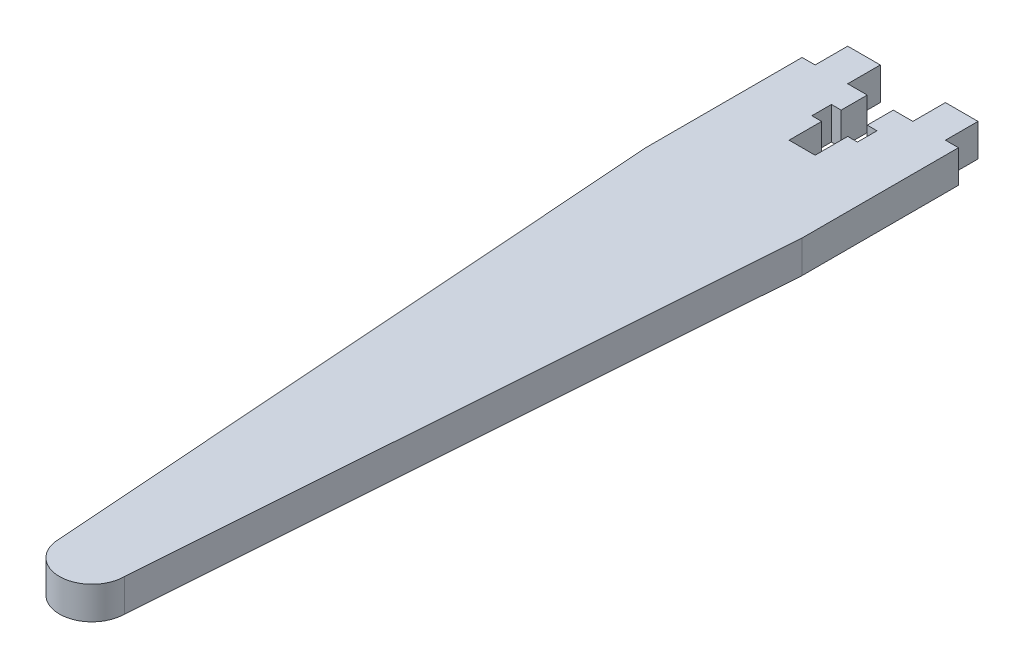
ISO-10303-21;
HEADER;
FILE_DESCRIPTION(('STEP AP214'),'2;1');
FILE_NAME('part.step','',(''),(''),'','','');
FILE_SCHEMA(('AUTOMOTIVE_DESIGN { 1 0 10303 214 1 1 1 1 }'));
ENDSEC;
DATA;
#1=APPLICATION_CONTEXT('core data for automotive mechanical design processes');
#2=APPLICATION_PROTOCOL_DEFINITION('international standard','automotive_design',2000,#1);
#3=PRODUCT_CONTEXT('',#1,'mechanical');
#4=PRODUCT('Part','Part','',(#3));
#5=PRODUCT_RELATED_PRODUCT_CATEGORY('part','',(#4));
#6=PRODUCT_DEFINITION_FORMATION('','',#4);
#7=PRODUCT_DEFINITION_CONTEXT('part definition',#1,'design');
#8=PRODUCT_DEFINITION('design','',#6,#7);
#9=PRODUCT_DEFINITION_SHAPE('','',#8);
#10=(LENGTH_UNIT() NAMED_UNIT(*) SI_UNIT(.MILLI.,.METRE.));
#11=(NAMED_UNIT(*) PLANE_ANGLE_UNIT() SI_UNIT($,.RADIAN.));
#12=(NAMED_UNIT(*) SI_UNIT($,.STERADIAN.) SOLID_ANGLE_UNIT());
#13=UNCERTAINTY_MEASURE_WITH_UNIT(LENGTH_MEASURE(1.E-05),#10,'distance_accuracy_value','');
#14=(GEOMETRIC_REPRESENTATION_CONTEXT(3) GLOBAL_UNCERTAINTY_ASSIGNED_CONTEXT((#13)) GLOBAL_UNIT_ASSIGNED_CONTEXT((#10,
#11,#12)) REPRESENTATION_CONTEXT('',''));
#15=CARTESIAN_POINT('',(0.,0.,0.));
#16=DIRECTION('',(0.,0.,1.));
#17=DIRECTION('',(1.,0.,0.));
#18=AXIS2_PLACEMENT_3D('',#15,#16,#17);
#19=CARTESIAN_POINT('',(0.,5.,0.));
#20=DIRECTION('',(0.997406236533879,0.,-0.0719777696467749));
#21=DIRECTION('',(-0.0719777696467749,0.,-0.997406236533879));
#22=AXIS2_PLACEMENT_3D('',#19,#20,#21);
#23=PLANE('',#22);
#24=DIRECTION('',(0.0719777696467749,0.,0.997406236533879));
#25=VECTOR('',#24,1.);
#26=CARTESIAN_POINT('',(0.,0.,0.));
#27=LINE('',#26,#25);
#28=CARTESIAN_POINT('',(0.,0.,0.));
#29=VERTEX_POINT('',#28);
#30=CARTESIAN_POINT('',(7.00000000000001,0.,97.));
#31=VERTEX_POINT('',#30);
#32=EDGE_CURVE('E237',#29,#31,#27,.T.);
#33=ORIENTED_EDGE('',*,*,#32,.T.);
#34=DIRECTION('',(0.,-1.,0.));
#35=VECTOR('',#34,1.);
#36=CARTESIAN_POINT('',(7.00000000000001,5.,97.));
#37=LINE('',#36,#35);
#38=CARTESIAN_POINT('',(7.00000000000001,5.,97.));
#39=VERTEX_POINT('',#38);
#40=EDGE_CURVE('E11',#39,#31,#37,.T.);
#41=ORIENTED_EDGE('',*,*,#40,.F.);
#42=DIRECTION('',(0.0719777696467749,0.,0.997406236533879));
#43=VECTOR('',#42,1.);
#44=CARTESIAN_POINT('',(0.,5.,0.));
#45=LINE('',#44,#43);
#46=CARTESIAN_POINT('',(0.,5.,0.));
#47=VERTEX_POINT('',#46);
#48=EDGE_CURVE('E287',#47,#39,#45,.T.);
#49=ORIENTED_EDGE('',*,*,#48,.F.);
#50=DIRECTION('',(0.,-1.,0.));
#51=VECTOR('',#50,1.);
#52=CARTESIAN_POINT('',(0.,5.,0.));
#53=LINE('',#52,#51);
#54=EDGE_CURVE('E233',#47,#29,#53,.T.);
#55=ORIENTED_EDGE('',*,*,#54,.T.);
#56=EDGE_LOOP('',(#33,#41,#49,#55));
#57=FACE_BOUND('',#56,.T.);
#58=ADVANCED_FACE('F33',(#57),#23,.F.);
#59=CARTESIAN_POINT('',(12.,5.,97.));
#60=DIRECTION('',(0.,-1.,0.));
#61=DIRECTION('',(0.,0.,-1.));
#62=AXIS2_PLACEMENT_3D('',#59,#60,#61);
#63=CYLINDRICAL_SURFACE('',#62,5.);
#64=CARTESIAN_POINT('',(12.,0.,97.));
#65=DIRECTION('',(0.,1.,0.));
#66=DIRECTION('',(0.,0.,1.));
#67=AXIS2_PLACEMENT_3D('',#64,#65,#66);
#68=CIRCLE('',#67,5.);
#69=CARTESIAN_POINT('',(17.,0.,97.));
#70=VERTEX_POINT('',#69);
#71=EDGE_CURVE('E240',#31,#70,#68,.T.);
#72=ORIENTED_EDGE('',*,*,#71,.T.);
#73=DIRECTION('',(0.,-1.,0.));
#74=VECTOR('',#73,1.);
#75=CARTESIAN_POINT('',(17.,5.,97.));
#76=LINE('',#75,#74);
#77=CARTESIAN_POINT('',(17.,5.,97.));
#78=VERTEX_POINT('',#77);
#79=EDGE_CURVE('E41',#78,#70,#76,.T.);
#80=ORIENTED_EDGE('',*,*,#79,.F.);
#81=CARTESIAN_POINT('',(12.,5.,97.));
#82=DIRECTION('',(0.,1.,0.));
#83=DIRECTION('',(0.,0.,1.));
#84=AXIS2_PLACEMENT_3D('',#81,#82,#83);
#85=CIRCLE('',#84,5.);
#86=EDGE_CURVE('E146',#39,#78,#85,.T.);
#87=ORIENTED_EDGE('',*,*,#86,.F.);
#88=ORIENTED_EDGE('',*,*,#40,.T.);
#89=EDGE_LOOP('',(#72,#80,#87,#88));
#90=FACE_BOUND('',#89,.T.);
#91=ADVANCED_FACE('F435',(#90),#63,.T.);
#92=CARTESIAN_POINT('',(24.,5.,0.));
#93=DIRECTION('',(-0.997406236533879,0.,-0.0719777696467746));
#94=DIRECTION('',(-0.0719777696467746,0.,0.997406236533879));
#95=AXIS2_PLACEMENT_3D('',#92,#93,#94);
#96=PLANE('',#95);
#97=DIRECTION('',(0.0719777696467746,0.,-0.997406236533879));
#98=VECTOR('',#97,1.);
#99=CARTESIAN_POINT('',(24.,0.,0.));
#100=LINE('',#99,#98);
#101=CARTESIAN_POINT('',(24.,0.,0.));
#102=VERTEX_POINT('',#101);
#103=EDGE_CURVE('E242',#70,#102,#100,.T.);
#104=ORIENTED_EDGE('',*,*,#103,.T.);
#105=DIRECTION('',(0.,-1.,0.));
#106=VECTOR('',#105,1.);
#107=CARTESIAN_POINT('',(24.,5.,0.));
#108=LINE('',#107,#106);
#109=CARTESIAN_POINT('',(24.,5.,0.));
#110=VERTEX_POINT('',#109);
#111=EDGE_CURVE('E348',#110,#102,#108,.T.);
#112=ORIENTED_EDGE('',*,*,#111,.F.);
#113=DIRECTION('',(0.0719777696467746,0.,-0.997406236533879));
#114=VECTOR('',#113,1.);
#115=CARTESIAN_POINT('',(24.,5.,0.));
#116=LINE('',#115,#114);
#117=EDGE_CURVE('E356',#78,#110,#116,.T.);
#118=ORIENTED_EDGE('',*,*,#117,.F.);
#119=ORIENTED_EDGE('',*,*,#79,.T.);
#120=EDGE_LOOP('',(#104,#112,#118,#119));
#121=FACE_BOUND('',#120,.T.);
#122=ADVANCED_FACE('F354',(#121),#96,.F.);
#123=CARTESIAN_POINT('',(24.,5.,0.));
#124=DIRECTION('',(-1.,0.,0.));
#125=DIRECTION('',(0.,0.,1.));
#126=AXIS2_PLACEMENT_3D('',#123,#124,#125);
#127=PLANE('',#126);
#128=DIRECTION('',(0.,0.,-1.));
#129=VECTOR('',#128,1.);
#130=CARTESIAN_POINT('',(24.,0.,0.));
#131=LINE('',#130,#129);
#132=CARTESIAN_POINT('',(24.,0.,-24.));
#133=VERTEX_POINT('',#132);
#134=EDGE_CURVE('E244',#102,#133,#131,.T.);
#135=ORIENTED_EDGE('',*,*,#134,.T.);
#136=DIRECTION('',(0.,-1.,0.));
#137=VECTOR('',#136,1.);
#138=CARTESIAN_POINT('',(24.,5.,-24.));
#139=LINE('',#138,#137);
#140=CARTESIAN_POINT('',(24.,5.,-24.));
#141=VERTEX_POINT('',#140);
#142=EDGE_CURVE('E345',#141,#133,#139,.T.);
#143=ORIENTED_EDGE('',*,*,#142,.F.);
#144=DIRECTION('',(0.,0.,-1.));
#145=VECTOR('',#144,1.);
#146=CARTESIAN_POINT('',(24.,5.,0.));
#147=LINE('',#146,#145);
#148=EDGE_CURVE('E374',#110,#141,#147,.T.);
#149=ORIENTED_EDGE('',*,*,#148,.F.);
#150=ORIENTED_EDGE('',*,*,#111,.T.);
#151=EDGE_LOOP('',(#135,#143,#149,#150));
#152=FACE_BOUND('',#151,.T.);
#153=ADVANCED_FACE('F365',(#152),#127,.F.);
#154=CARTESIAN_POINT('',(22.,5.,-24.));
#155=DIRECTION('',(0.,0.,1.));
#156=DIRECTION('',(1.,0.,0.));
#157=AXIS2_PLACEMENT_3D('',#154,#155,#156);
#158=PLANE('',#157);
#159=DIRECTION('',(-1.,0.,0.));
#160=VECTOR('',#159,1.);
#161=CARTESIAN_POINT('',(22.,0.,-24.));
#162=LINE('',#161,#160);
#163=CARTESIAN_POINT('',(22.,0.,-24.));
#164=VERTEX_POINT('',#163);
#165=EDGE_CURVE('E246',#133,#164,#162,.T.);
#166=ORIENTED_EDGE('',*,*,#165,.T.);
#167=DIRECTION('',(0.,-1.,0.));
#168=VECTOR('',#167,1.);
#169=CARTESIAN_POINT('',(22.,5.,-24.));
#170=LINE('',#169,#168);
#171=CARTESIAN_POINT('',(22.,5.,-24.));
#172=VERTEX_POINT('',#171);
#173=EDGE_CURVE('E342',#172,#164,#170,.T.);
#174=ORIENTED_EDGE('',*,*,#173,.F.);
#175=DIRECTION('',(-1.,0.,0.));
#176=VECTOR('',#175,1.);
#177=CARTESIAN_POINT('',(22.,5.,-24.));
#178=LINE('',#177,#176);
#179=EDGE_CURVE('E371',#141,#172,#178,.T.);
#180=ORIENTED_EDGE('',*,*,#179,.F.);
#181=ORIENTED_EDGE('',*,*,#142,.T.);
#182=EDGE_LOOP('',(#166,#174,#180,#181));
#183=FACE_BOUND('',#182,.T.);
#184=ADVANCED_FACE('F369',(#183),#158,.F.);
#185=CARTESIAN_POINT('',(22.,5.,-24.));
#186=DIRECTION('',(-1.,0.,0.));
#187=DIRECTION('',(0.,0.,1.));
#188=AXIS2_PLACEMENT_3D('',#185,#186,#187);
#189=PLANE('',#188);
#190=DIRECTION('',(0.,0.,-1.));
#191=VECTOR('',#190,1.);
#192=CARTESIAN_POINT('',(22.,0.,-24.));
#193=LINE('',#192,#191);
#194=CARTESIAN_POINT('',(22.,0.,-29.));
#195=VERTEX_POINT('',#194);
#196=EDGE_CURVE('E248',#164,#195,#193,.T.);
#197=ORIENTED_EDGE('',*,*,#196,.T.);
#198=DIRECTION('',(0.,-1.,0.));
#199=VECTOR('',#198,1.);
#200=CARTESIAN_POINT('',(22.,5.,-29.));
#201=LINE('',#200,#199);
#202=CARTESIAN_POINT('',(22.,5.,-29.));
#203=VERTEX_POINT('',#202);
#204=EDGE_CURVE('E339',#203,#195,#201,.T.);
#205=ORIENTED_EDGE('',*,*,#204,.F.);
#206=DIRECTION('',(0.,0.,-1.));
#207=VECTOR('',#206,1.);
#208=CARTESIAN_POINT('',(22.,5.,-24.));
#209=LINE('',#208,#207);
#210=EDGE_CURVE('E373',#172,#203,#209,.T.);
#211=ORIENTED_EDGE('',*,*,#210,.F.);
#212=ORIENTED_EDGE('',*,*,#173,.T.);
#213=EDGE_LOOP('',(#197,#205,#211,#212));
#214=FACE_BOUND('',#213,.T.);
#215=ADVANCED_FACE('F448',(#214),#189,.F.);
#216=CARTESIAN_POINT('',(17.,5.,-29.));
#217=DIRECTION('',(0.,0.,1.));
#218=DIRECTION('',(1.,0.,0.));
#219=AXIS2_PLACEMENT_3D('',#216,#217,#218);
#220=PLANE('',#219);
#221=DIRECTION('',(-1.,0.,0.));
#222=VECTOR('',#221,1.);
#223=CARTESIAN_POINT('',(17.,0.,-29.));
#224=LINE('',#223,#222);
#225=CARTESIAN_POINT('',(17.,0.,-29.));
#226=VERTEX_POINT('',#225);
#227=EDGE_CURVE('E250',#195,#226,#224,.T.);
#228=ORIENTED_EDGE('',*,*,#227,.T.);
#229=DIRECTION('',(0.,-1.,0.));
#230=VECTOR('',#229,1.);
#231=CARTESIAN_POINT('',(17.,5.,-29.));
#232=LINE('',#231,#230);
#233=CARTESIAN_POINT('',(17.,5.,-29.));
#234=VERTEX_POINT('',#233);
#235=EDGE_CURVE('E336',#234,#226,#232,.T.);
#236=ORIENTED_EDGE('',*,*,#235,.F.);
#237=DIRECTION('',(-1.,0.,0.));
#238=VECTOR('',#237,1.);
#239=CARTESIAN_POINT('',(17.,5.,-29.));
#240=LINE('',#239,#238);
#241=EDGE_CURVE('E376',#203,#234,#240,.T.);
#242=ORIENTED_EDGE('',*,*,#241,.F.);
#243=ORIENTED_EDGE('',*,*,#204,.T.);
#244=EDGE_LOOP('',(#228,#236,#242,#243));
#245=FACE_BOUND('',#244,.T.);
#246=ADVANCED_FACE('F451',(#245),#220,.F.);
#247=CARTESIAN_POINT('',(17.,5.,-24.));
#248=DIRECTION('',(1.,0.,0.));
#249=DIRECTION('',(0.,0.,-1.));
#250=AXIS2_PLACEMENT_3D('',#247,#248,#249);
#251=PLANE('',#250);
#252=DIRECTION('',(0.,0.,1.));
#253=VECTOR('',#252,1.);
#254=CARTESIAN_POINT('',(17.,0.,-24.));
#255=LINE('',#254,#253);
#256=CARTESIAN_POINT('',(17.,0.,-24.));
#257=VERTEX_POINT('',#256);
#258=EDGE_CURVE('E252',#226,#257,#255,.T.);
#259=ORIENTED_EDGE('',*,*,#258,.T.);
#260=DIRECTION('',(0.,-1.,0.));
#261=VECTOR('',#260,1.);
#262=CARTESIAN_POINT('',(17.,5.,-24.));
#263=LINE('',#262,#261);
#264=CARTESIAN_POINT('',(17.,5.,-24.));
#265=VERTEX_POINT('',#264);
#266=EDGE_CURVE('E333',#265,#257,#263,.T.);
#267=ORIENTED_EDGE('',*,*,#266,.F.);
#268=DIRECTION('',(0.,0.,1.));
#269=VECTOR('',#268,1.);
#270=CARTESIAN_POINT('',(17.,5.,-24.));
#271=LINE('',#270,#269);
#272=EDGE_CURVE('E382',#234,#265,#271,.T.);
#273=ORIENTED_EDGE('',*,*,#272,.F.);
#274=ORIENTED_EDGE('',*,*,#235,.T.);
#275=EDGE_LOOP('',(#259,#267,#273,#274));
#276=FACE_BOUND('',#275,.T.);
#277=ADVANCED_FACE('F455',(#276),#251,.F.);
#278=CARTESIAN_POINT('',(14.,5.,-24.));
#279=DIRECTION('',(0.,0.,1.));
#280=DIRECTION('',(1.,0.,0.));
#281=AXIS2_PLACEMENT_3D('',#278,#279,#280);
#282=PLANE('',#281);
#283=DIRECTION('',(-1.,0.,0.));
#284=VECTOR('',#283,1.);
#285=CARTESIAN_POINT('',(14.,0.,-24.));
#286=LINE('',#285,#284);
#287=CARTESIAN_POINT('',(14.,0.,-24.));
#288=VERTEX_POINT('',#287);
#289=EDGE_CURVE('E254',#257,#288,#286,.T.);
#290=ORIENTED_EDGE('',*,*,#289,.T.);
#291=DIRECTION('',(0.,-1.,0.));
#292=VECTOR('',#291,1.);
#293=CARTESIAN_POINT('',(14.,5.,-24.));
#294=LINE('',#293,#292);
#295=CARTESIAN_POINT('',(14.,5.,-24.));
#296=VERTEX_POINT('',#295);
#297=EDGE_CURVE('E330',#296,#288,#294,.T.);
#298=ORIENTED_EDGE('',*,*,#297,.F.);
#299=DIRECTION('',(-1.,0.,0.));
#300=VECTOR('',#299,1.);
#301=CARTESIAN_POINT('',(14.,5.,-24.));
#302=LINE('',#301,#300);
#303=EDGE_CURVE('E384',#265,#296,#302,.T.);
#304=ORIENTED_EDGE('',*,*,#303,.F.);
#305=ORIENTED_EDGE('',*,*,#266,.T.);
#306=EDGE_LOOP('',(#290,#298,#304,#305));
#307=FACE_BOUND('',#306,.T.);
#308=ADVANCED_FACE('F459',(#307),#282,.F.);
#309=CARTESIAN_POINT('',(14.,5.,-20.));
#310=DIRECTION('',(1.,0.,0.));
#311=DIRECTION('',(0.,0.,-1.));
#312=AXIS2_PLACEMENT_3D('',#309,#310,#311);
#313=PLANE('',#312);
#314=DIRECTION('',(0.,0.,1.));
#315=VECTOR('',#314,1.);
#316=CARTESIAN_POINT('',(14.,0.,-20.));
#317=LINE('',#316,#315);
#318=CARTESIAN_POINT('',(14.,0.,-20.));
#319=VERTEX_POINT('',#318);
#320=EDGE_CURVE('E256',#288,#319,#317,.T.);
#321=ORIENTED_EDGE('',*,*,#320,.T.);
#322=DIRECTION('',(0.,-1.,0.));
#323=VECTOR('',#322,1.);
#324=CARTESIAN_POINT('',(14.,5.,-20.));
#325=LINE('',#324,#323);
#326=CARTESIAN_POINT('',(14.,5.,-20.));
#327=VERTEX_POINT('',#326);
#328=EDGE_CURVE('E327',#327,#319,#325,.T.);
#329=ORIENTED_EDGE('',*,*,#328,.F.);
#330=DIRECTION('',(0.,0.,1.));
#331=VECTOR('',#330,1.);
#332=CARTESIAN_POINT('',(14.,5.,-20.));
#333=LINE('',#332,#331);
#334=EDGE_CURVE('E386',#296,#327,#333,.T.);
#335=ORIENTED_EDGE('',*,*,#334,.F.);
#336=ORIENTED_EDGE('',*,*,#297,.T.);
#337=EDGE_LOOP('',(#321,#329,#335,#336));
#338=FACE_BOUND('',#337,.T.);
#339=ADVANCED_FACE('F463',(#338),#313,.F.);
#340=CARTESIAN_POINT('',(14.,5.,-20.));
#341=DIRECTION('',(0.,0.,-1.));
#342=DIRECTION('',(-1.,0.,0.));
#343=AXIS2_PLACEMENT_3D('',#340,#341,#342);
#344=PLANE('',#343);
#345=DIRECTION('',(1.,0.,0.));
#346=VECTOR('',#345,1.);
#347=CARTESIAN_POINT('',(14.,0.,-20.));
#348=LINE('',#347,#346);
#349=CARTESIAN_POINT('',(15.5,0.,-20.));
#350=VERTEX_POINT('',#349);
#351=EDGE_CURVE('E258',#319,#350,#348,.T.);
#352=ORIENTED_EDGE('',*,*,#351,.T.);
#353=DIRECTION('',(0.,-1.,0.));
#354=VECTOR('',#353,1.);
#355=CARTESIAN_POINT('',(15.5,5.,-20.));
#356=LINE('',#355,#354);
#357=CARTESIAN_POINT('',(15.5,5.,-20.));
#358=VERTEX_POINT('',#357);
#359=EDGE_CURVE('E324',#358,#350,#356,.T.);
#360=ORIENTED_EDGE('',*,*,#359,.F.);
#361=DIRECTION('',(1.,0.,0.));
#362=VECTOR('',#361,1.);
#363=CARTESIAN_POINT('',(14.,5.,-20.));
#364=LINE('',#363,#362);
#365=EDGE_CURVE('E388',#327,#358,#364,.T.);
#366=ORIENTED_EDGE('',*,*,#365,.F.);
#367=ORIENTED_EDGE('',*,*,#328,.T.);
#368=EDGE_LOOP('',(#352,#360,#366,#367));
#369=FACE_BOUND('',#368,.T.);
#370=ADVANCED_FACE('F467',(#369),#344,.F.);
#371=CARTESIAN_POINT('',(15.5,5.,-20.));
#372=DIRECTION('',(1.,0.,0.));
#373=DIRECTION('',(0.,0.,-1.));
#374=AXIS2_PLACEMENT_3D('',#371,#372,#373);
#375=PLANE('',#374);
#376=DIRECTION('',(0.,0.,1.));
#377=VECTOR('',#376,1.);
#378=CARTESIAN_POINT('',(15.5,0.,-20.));
#379=LINE('',#378,#377);
#380=CARTESIAN_POINT('',(15.5,0.,-17.));
#381=VERTEX_POINT('',#380);
#382=EDGE_CURVE('E260',#350,#381,#379,.T.);
#383=ORIENTED_EDGE('',*,*,#382,.T.);
#384=DIRECTION('',(0.,-1.,0.));
#385=VECTOR('',#384,1.);
#386=CARTESIAN_POINT('',(15.5,5.,-17.));
#387=LINE('',#386,#385);
#388=CARTESIAN_POINT('',(15.5,5.,-17.));
#389=VERTEX_POINT('',#388);
#390=EDGE_CURVE('E321',#389,#381,#387,.T.);
#391=ORIENTED_EDGE('',*,*,#390,.F.);
#392=DIRECTION('',(0.,0.,1.));
#393=VECTOR('',#392,1.);
#394=CARTESIAN_POINT('',(15.5,5.,-20.));
#395=LINE('',#394,#393);
#396=EDGE_CURVE('E390',#358,#389,#395,.T.);
#397=ORIENTED_EDGE('',*,*,#396,.F.);
#398=ORIENTED_EDGE('',*,*,#359,.T.);
#399=EDGE_LOOP('',(#383,#391,#397,#398));
#400=FACE_BOUND('',#399,.T.);
#401=ADVANCED_FACE('F471',(#400),#375,.F.);
#402=CARTESIAN_POINT('',(14.,5.,-17.));
#403=DIRECTION('',(0.,0.,1.));
#404=DIRECTION('',(1.,0.,0.));
#405=AXIS2_PLACEMENT_3D('',#402,#403,#404);
#406=PLANE('',#405);
#407=DIRECTION('',(-1.,0.,0.));
#408=VECTOR('',#407,1.);
#409=CARTESIAN_POINT('',(14.,0.,-17.));
#410=LINE('',#409,#408);
#411=CARTESIAN_POINT('',(14.,0.,-17.));
#412=VERTEX_POINT('',#411);
#413=EDGE_CURVE('E262',#381,#412,#410,.T.);
#414=ORIENTED_EDGE('',*,*,#413,.T.);
#415=DIRECTION('',(0.,-1.,0.));
#416=VECTOR('',#415,1.);
#417=CARTESIAN_POINT('',(14.,5.,-17.));
#418=LINE('',#417,#416);
#419=CARTESIAN_POINT('',(14.,5.,-17.));
#420=VERTEX_POINT('',#419);
#421=EDGE_CURVE('E318',#420,#412,#418,.T.);
#422=ORIENTED_EDGE('',*,*,#421,.F.);
#423=DIRECTION('',(-1.,0.,0.));
#424=VECTOR('',#423,1.);
#425=CARTESIAN_POINT('',(14.,5.,-17.));
#426=LINE('',#425,#424);
#427=EDGE_CURVE('E392',#389,#420,#426,.T.);
#428=ORIENTED_EDGE('',*,*,#427,.F.);
#429=ORIENTED_EDGE('',*,*,#390,.T.);
#430=EDGE_LOOP('',(#414,#422,#428,#429));
#431=FACE_BOUND('',#430,.T.);
#432=ADVANCED_FACE('F475',(#431),#406,.F.);
#433=CARTESIAN_POINT('',(14.,5.,-12.));
#434=DIRECTION('',(1.,0.,0.));
#435=DIRECTION('',(0.,0.,-1.));
#436=AXIS2_PLACEMENT_3D('',#433,#434,#435);
#437=PLANE('',#436);
#438=DIRECTION('',(0.,0.,1.));
#439=VECTOR('',#438,1.);
#440=CARTESIAN_POINT('',(14.,0.,-12.));
#441=LINE('',#440,#439);
#442=CARTESIAN_POINT('',(14.,0.,-12.));
#443=VERTEX_POINT('',#442);
#444=EDGE_CURVE('E264',#412,#443,#441,.T.);
#445=ORIENTED_EDGE('',*,*,#444,.T.);
#446=DIRECTION('',(0.,-1.,0.));
#447=VECTOR('',#446,1.);
#448=CARTESIAN_POINT('',(14.,5.,-12.));
#449=LINE('',#448,#447);
#450=CARTESIAN_POINT('',(14.,5.,-12.));
#451=VERTEX_POINT('',#450);
#452=EDGE_CURVE('E315',#451,#443,#449,.T.);
#453=ORIENTED_EDGE('',*,*,#452,.F.);
#454=DIRECTION('',(0.,0.,1.));
#455=VECTOR('',#454,1.);
#456=CARTESIAN_POINT('',(14.,5.,-12.));
#457=LINE('',#456,#455);
#458=EDGE_CURVE('E394',#420,#451,#457,.T.);
#459=ORIENTED_EDGE('',*,*,#458,.F.);
#460=ORIENTED_EDGE('',*,*,#421,.T.);
#461=EDGE_LOOP('',(#445,#453,#459,#460));
#462=FACE_BOUND('',#461,.T.);
#463=ADVANCED_FACE('F479',(#462),#437,.F.);
#464=CARTESIAN_POINT('',(10.,5.,-12.));
#465=DIRECTION('',(0.,0.,1.));
#466=DIRECTION('',(1.,0.,0.));
#467=AXIS2_PLACEMENT_3D('',#464,#465,#466);
#468=PLANE('',#467);
#469=DIRECTION('',(-1.,0.,0.));
#470=VECTOR('',#469,1.);
#471=CARTESIAN_POINT('',(10.,0.,-12.));
#472=LINE('',#471,#470);
#473=CARTESIAN_POINT('',(10.,0.,-12.));
#474=VERTEX_POINT('',#473);
#475=EDGE_CURVE('E266',#443,#474,#472,.T.);
#476=ORIENTED_EDGE('',*,*,#475,.T.);
#477=DIRECTION('',(0.,-1.,0.));
#478=VECTOR('',#477,1.);
#479=CARTESIAN_POINT('',(10.,5.,-12.));
#480=LINE('',#479,#478);
#481=CARTESIAN_POINT('',(10.,5.,-12.));
#482=VERTEX_POINT('',#481);
#483=EDGE_CURVE('E312',#482,#474,#480,.T.);
#484=ORIENTED_EDGE('',*,*,#483,.F.);
#485=DIRECTION('',(-1.,0.,0.));
#486=VECTOR('',#485,1.);
#487=CARTESIAN_POINT('',(10.,5.,-12.));
#488=LINE('',#487,#486);
#489=EDGE_CURVE('E396',#451,#482,#488,.T.);
#490=ORIENTED_EDGE('',*,*,#489,.F.);
#491=ORIENTED_EDGE('',*,*,#452,.T.);
#492=EDGE_LOOP('',(#476,#484,#490,#491));
#493=FACE_BOUND('',#492,.T.);
#494=ADVANCED_FACE('F483',(#493),#468,.F.);
#495=CARTESIAN_POINT('',(10.,5.,-12.));
#496=DIRECTION('',(-1.,0.,0.));
#497=DIRECTION('',(0.,0.,1.));
#498=AXIS2_PLACEMENT_3D('',#495,#496,#497);
#499=PLANE('',#498);
#500=DIRECTION('',(0.,0.,-1.));
#501=VECTOR('',#500,1.);
#502=CARTESIAN_POINT('',(10.,0.,-12.));
#503=LINE('',#502,#501);
#504=CARTESIAN_POINT('',(10.,0.,-17.));
#505=VERTEX_POINT('',#504);
#506=EDGE_CURVE('E268',#474,#505,#503,.T.);
#507=ORIENTED_EDGE('',*,*,#506,.T.);
#508=DIRECTION('',(0.,-1.,0.));
#509=VECTOR('',#508,1.);
#510=CARTESIAN_POINT('',(10.,5.,-17.));
#511=LINE('',#510,#509);
#512=CARTESIAN_POINT('',(10.,5.,-17.));
#513=VERTEX_POINT('',#512);
#514=EDGE_CURVE('E309',#513,#505,#511,.T.);
#515=ORIENTED_EDGE('',*,*,#514,.F.);
#516=DIRECTION('',(0.,0.,-1.));
#517=VECTOR('',#516,1.);
#518=CARTESIAN_POINT('',(10.,5.,-12.));
#519=LINE('',#518,#517);
#520=EDGE_CURVE('E398',#482,#513,#519,.T.);
#521=ORIENTED_EDGE('',*,*,#520,.F.);
#522=ORIENTED_EDGE('',*,*,#483,.T.);
#523=EDGE_LOOP('',(#507,#515,#521,#522));
#524=FACE_BOUND('',#523,.T.);
#525=ADVANCED_FACE('F487',(#524),#499,.F.);
#526=CARTESIAN_POINT('',(10.,5.,-17.));
#527=DIRECTION('',(0.,0.,1.));
#528=DIRECTION('',(1.,0.,0.));
#529=AXIS2_PLACEMENT_3D('',#526,#527,#528);
#530=PLANE('',#529);
#531=DIRECTION('',(-1.,0.,0.));
#532=VECTOR('',#531,1.);
#533=CARTESIAN_POINT('',(10.,0.,-17.));
#534=LINE('',#533,#532);
#535=CARTESIAN_POINT('',(8.5,0.,-17.));
#536=VERTEX_POINT('',#535);
#537=EDGE_CURVE('E270',#505,#536,#534,.T.);
#538=ORIENTED_EDGE('',*,*,#537,.T.);
#539=DIRECTION('',(0.,-1.,0.));
#540=VECTOR('',#539,1.);
#541=CARTESIAN_POINT('',(8.5,5.,-17.));
#542=LINE('',#541,#540);
#543=CARTESIAN_POINT('',(8.5,5.,-17.));
#544=VERTEX_POINT('',#543);
#545=EDGE_CURVE('E306',#544,#536,#542,.T.);
#546=ORIENTED_EDGE('',*,*,#545,.F.);
#547=DIRECTION('',(-1.,0.,0.));
#548=VECTOR('',#547,1.);
#549=CARTESIAN_POINT('',(10.,5.,-17.));
#550=LINE('',#549,#548);
#551=EDGE_CURVE('E400',#513,#544,#550,.T.);
#552=ORIENTED_EDGE('',*,*,#551,.F.);
#553=ORIENTED_EDGE('',*,*,#514,.T.);
#554=EDGE_LOOP('',(#538,#546,#552,#553));
#555=FACE_BOUND('',#554,.T.);
#556=ADVANCED_FACE('F491',(#555),#530,.F.);
#557=CARTESIAN_POINT('',(8.5,5.,-20.));
#558=DIRECTION('',(-1.,0.,0.));
#559=DIRECTION('',(0.,0.,1.));
#560=AXIS2_PLACEMENT_3D('',#557,#558,#559);
#561=PLANE('',#560);
#562=DIRECTION('',(0.,0.,-1.));
#563=VECTOR('',#562,1.);
#564=CARTESIAN_POINT('',(8.5,0.,-20.));
#565=LINE('',#564,#563);
#566=CARTESIAN_POINT('',(8.5,0.,-20.));
#567=VERTEX_POINT('',#566);
#568=EDGE_CURVE('E272',#536,#567,#565,.T.);
#569=ORIENTED_EDGE('',*,*,#568,.T.);
#570=DIRECTION('',(0.,-1.,0.));
#571=VECTOR('',#570,1.);
#572=CARTESIAN_POINT('',(8.5,5.,-20.));
#573=LINE('',#572,#571);
#574=CARTESIAN_POINT('',(8.5,5.,-20.));
#575=VERTEX_POINT('',#574);
#576=EDGE_CURVE('E303',#575,#567,#573,.T.);
#577=ORIENTED_EDGE('',*,*,#576,.F.);
#578=DIRECTION('',(0.,0.,-1.));
#579=VECTOR('',#578,1.);
#580=CARTESIAN_POINT('',(8.5,5.,-20.));
#581=LINE('',#580,#579);
#582=EDGE_CURVE('E402',#544,#575,#581,.T.);
#583=ORIENTED_EDGE('',*,*,#582,.F.);
#584=ORIENTED_EDGE('',*,*,#545,.T.);
#585=EDGE_LOOP('',(#569,#577,#583,#584));
#586=FACE_BOUND('',#585,.T.);
#587=ADVANCED_FACE('F495',(#586),#561,.F.);
#588=CARTESIAN_POINT('',(10.,5.,-20.));
#589=DIRECTION('',(0.,0.,-1.));
#590=DIRECTION('',(-1.,0.,0.));
#591=AXIS2_PLACEMENT_3D('',#588,#589,#590);
#592=PLANE('',#591);
#593=DIRECTION('',(1.,0.,0.));
#594=VECTOR('',#593,1.);
#595=CARTESIAN_POINT('',(10.,0.,-20.));
#596=LINE('',#595,#594);
#597=CARTESIAN_POINT('',(10.,0.,-20.));
#598=VERTEX_POINT('',#597);
#599=EDGE_CURVE('E274',#567,#598,#596,.T.);
#600=ORIENTED_EDGE('',*,*,#599,.T.);
#601=DIRECTION('',(0.,-1.,0.));
#602=VECTOR('',#601,1.);
#603=CARTESIAN_POINT('',(10.,5.,-20.));
#604=LINE('',#603,#602);
#605=CARTESIAN_POINT('',(10.,5.,-20.));
#606=VERTEX_POINT('',#605);
#607=EDGE_CURVE('E300',#606,#598,#604,.T.);
#608=ORIENTED_EDGE('',*,*,#607,.F.);
#609=DIRECTION('',(1.,0.,0.));
#610=VECTOR('',#609,1.);
#611=CARTESIAN_POINT('',(10.,5.,-20.));
#612=LINE('',#611,#610);
#613=EDGE_CURVE('E404',#575,#606,#612,.T.);
#614=ORIENTED_EDGE('',*,*,#613,.F.);
#615=ORIENTED_EDGE('',*,*,#576,.T.);
#616=EDGE_LOOP('',(#600,#608,#614,#615));
#617=FACE_BOUND('',#616,.T.);
#618=ADVANCED_FACE('F499',(#617),#592,.F.);
#619=CARTESIAN_POINT('',(10.,5.,-20.));
#620=DIRECTION('',(-1.,0.,0.));
#621=DIRECTION('',(0.,0.,1.));
#622=AXIS2_PLACEMENT_3D('',#619,#620,#621);
#623=PLANE('',#622);
#624=DIRECTION('',(0.,0.,-1.));
#625=VECTOR('',#624,1.);
#626=CARTESIAN_POINT('',(10.,0.,-20.));
#627=LINE('',#626,#625);
#628=CARTESIAN_POINT('',(10.,0.,-24.));
#629=VERTEX_POINT('',#628);
#630=EDGE_CURVE('E276',#598,#629,#627,.T.);
#631=ORIENTED_EDGE('',*,*,#630,.T.);
#632=DIRECTION('',(0.,-1.,0.));
#633=VECTOR('',#632,1.);
#634=CARTESIAN_POINT('',(10.,5.,-24.));
#635=LINE('',#634,#633);
#636=CARTESIAN_POINT('',(10.,5.,-24.));
#637=VERTEX_POINT('',#636);
#638=EDGE_CURVE('E297',#637,#629,#635,.T.);
#639=ORIENTED_EDGE('',*,*,#638,.F.);
#640=DIRECTION('',(0.,0.,-1.));
#641=VECTOR('',#640,1.);
#642=CARTESIAN_POINT('',(10.,5.,-20.));
#643=LINE('',#642,#641);
#644=EDGE_CURVE('E406',#606,#637,#643,.T.);
#645=ORIENTED_EDGE('',*,*,#644,.F.);
#646=ORIENTED_EDGE('',*,*,#607,.T.);
#647=EDGE_LOOP('',(#631,#639,#645,#646));
#648=FACE_BOUND('',#647,.T.);
#649=ADVANCED_FACE('F503',(#648),#623,.F.);
#650=CARTESIAN_POINT('',(7.,5.,-24.));
#651=DIRECTION('',(0.,0.,1.));
#652=DIRECTION('',(1.,0.,0.));
#653=AXIS2_PLACEMENT_3D('',#650,#651,#652);
#654=PLANE('',#653);
#655=DIRECTION('',(-1.,0.,0.));
#656=VECTOR('',#655,1.);
#657=CARTESIAN_POINT('',(7.,0.,-24.));
#658=LINE('',#657,#656);
#659=CARTESIAN_POINT('',(7.,0.,-24.));
#660=VERTEX_POINT('',#659);
#661=EDGE_CURVE('E278',#629,#660,#658,.T.);
#662=ORIENTED_EDGE('',*,*,#661,.T.);
#663=DIRECTION('',(0.,-1.,0.));
#664=VECTOR('',#663,1.);
#665=CARTESIAN_POINT('',(7.,5.,-24.));
#666=LINE('',#665,#664);
#667=CARTESIAN_POINT('',(7.,5.,-24.));
#668=VERTEX_POINT('',#667);
#669=EDGE_CURVE('E294',#668,#660,#666,.T.);
#670=ORIENTED_EDGE('',*,*,#669,.F.);
#671=DIRECTION('',(-1.,0.,0.));
#672=VECTOR('',#671,1.);
#673=CARTESIAN_POINT('',(7.,5.,-24.));
#674=LINE('',#673,#672);
#675=EDGE_CURVE('E408',#637,#668,#674,.T.);
#676=ORIENTED_EDGE('',*,*,#675,.F.);
#677=ORIENTED_EDGE('',*,*,#638,.T.);
#678=EDGE_LOOP('',(#662,#670,#676,#677));
#679=FACE_BOUND('',#678,.T.);
#680=ADVANCED_FACE('F507',(#679),#654,.F.);
#681=CARTESIAN_POINT('',(7.,5.,-24.));
#682=DIRECTION('',(-1.,0.,0.));
#683=DIRECTION('',(0.,0.,1.));
#684=AXIS2_PLACEMENT_3D('',#681,#682,#683);
#685=PLANE('',#684);
#686=DIRECTION('',(0.,0.,-1.));
#687=VECTOR('',#686,1.);
#688=CARTESIAN_POINT('',(7.,0.,-24.));
#689=LINE('',#688,#687);
#690=CARTESIAN_POINT('',(7.,0.,-29.));
#691=VERTEX_POINT('',#690);
#692=EDGE_CURVE('E280',#660,#691,#689,.T.);
#693=ORIENTED_EDGE('',*,*,#692,.T.);
#694=DIRECTION('',(0.,-1.,0.));
#695=VECTOR('',#694,1.);
#696=CARTESIAN_POINT('',(7.,5.,-29.));
#697=LINE('',#696,#695);
#698=CARTESIAN_POINT('',(7.,5.,-29.));
#699=VERTEX_POINT('',#698);
#700=EDGE_CURVE('E291',#699,#691,#697,.T.);
#701=ORIENTED_EDGE('',*,*,#700,.F.);
#702=DIRECTION('',(0.,0.,-1.));
#703=VECTOR('',#702,1.);
#704=CARTESIAN_POINT('',(7.,5.,-24.));
#705=LINE('',#704,#703);
#706=EDGE_CURVE('E410',#668,#699,#705,.T.);
#707=ORIENTED_EDGE('',*,*,#706,.F.);
#708=ORIENTED_EDGE('',*,*,#669,.T.);
#709=EDGE_LOOP('',(#693,#701,#707,#708));
#710=FACE_BOUND('',#709,.T.);
#711=ADVANCED_FACE('F416',(#710),#685,.F.);
#712=CARTESIAN_POINT('',(7.,5.,-29.));
#713=DIRECTION('',(0.,0.,1.));
#714=DIRECTION('',(1.,0.,0.));
#715=AXIS2_PLACEMENT_3D('',#712,#713,#714);
#716=PLANE('',#715);
#717=DIRECTION('',(-1.,0.,0.));
#718=VECTOR('',#717,1.);
#719=CARTESIAN_POINT('',(7.,0.,-29.));
#720=LINE('',#719,#718);
#721=CARTESIAN_POINT('',(2.,0.,-29.));
#722=VERTEX_POINT('',#721);
#723=EDGE_CURVE('E282',#691,#722,#720,.T.);
#724=ORIENTED_EDGE('',*,*,#723,.T.);
#725=DIRECTION('',(0.,-1.,0.));
#726=VECTOR('',#725,1.);
#727=CARTESIAN_POINT('',(2.,5.,-29.));
#728=LINE('',#727,#726);
#729=CARTESIAN_POINT('',(2.,5.,-29.));
#730=VERTEX_POINT('',#729);
#731=EDGE_CURVE('E228',#730,#722,#728,.T.);
#732=ORIENTED_EDGE('',*,*,#731,.F.);
#733=DIRECTION('',(-1.,0.,0.));
#734=VECTOR('',#733,1.);
#735=CARTESIAN_POINT('',(7.,5.,-29.));
#736=LINE('',#735,#734);
#737=EDGE_CURVE('E219',#699,#730,#736,.T.);
#738=ORIENTED_EDGE('',*,*,#737,.F.);
#739=ORIENTED_EDGE('',*,*,#700,.T.);
#740=EDGE_LOOP('',(#724,#732,#738,#739));
#741=FACE_BOUND('',#740,.T.);
#742=ADVANCED_FACE('F420',(#741),#716,.F.);
#743=CARTESIAN_POINT('',(2.,5.,-24.));
#744=DIRECTION('',(1.,0.,0.));
#745=DIRECTION('',(0.,0.,-1.));
#746=AXIS2_PLACEMENT_3D('',#743,#744,#745);
#747=PLANE('',#746);
#748=DIRECTION('',(0.,0.,1.));
#749=VECTOR('',#748,1.);
#750=CARTESIAN_POINT('',(2.,0.,-24.));
#751=LINE('',#750,#749);
#752=CARTESIAN_POINT('',(2.,0.,-24.));
#753=VERTEX_POINT('',#752);
#754=EDGE_CURVE('E227',#722,#753,#751,.T.);
#755=ORIENTED_EDGE('',*,*,#754,.T.);
#756=DIRECTION('',(0.,-1.,0.));
#757=VECTOR('',#756,1.);
#758=CARTESIAN_POINT('',(2.,5.,-24.));
#759=LINE('',#758,#757);
#760=CARTESIAN_POINT('',(2.,5.,-24.));
#761=VERTEX_POINT('',#760);
#762=EDGE_CURVE('E224',#761,#753,#759,.T.);
#763=ORIENTED_EDGE('',*,*,#762,.F.);
#764=DIRECTION('',(0.,0.,1.));
#765=VECTOR('',#764,1.);
#766=CARTESIAN_POINT('',(2.,5.,-24.));
#767=LINE('',#766,#765);
#768=EDGE_CURVE('E213',#730,#761,#767,.T.);
#769=ORIENTED_EDGE('',*,*,#768,.F.);
#770=ORIENTED_EDGE('',*,*,#731,.T.);
#771=EDGE_LOOP('',(#755,#763,#769,#770));
#772=FACE_BOUND('',#771,.T.);
#773=ADVANCED_FACE('F225',(#772),#747,.F.);
#774=CARTESIAN_POINT('',(0.,5.,-24.));
#775=DIRECTION('',(0.,0.,1.));
#776=DIRECTION('',(1.,0.,0.));
#777=AXIS2_PLACEMENT_3D('',#774,#775,#776);
#778=PLANE('',#777);
#779=DIRECTION('',(-1.,0.,0.));
#780=VECTOR('',#779,1.);
#781=CARTESIAN_POINT('',(0.,0.,-24.));
#782=LINE('',#781,#780);
#783=CARTESIAN_POINT('',(0.,0.,-24.));
#784=VERTEX_POINT('',#783);
#785=EDGE_CURVE('E132',#753,#784,#782,.T.);
#786=ORIENTED_EDGE('',*,*,#785,.T.);
#787=DIRECTION('',(0.,-1.,0.));
#788=VECTOR('',#787,1.);
#789=CARTESIAN_POINT('',(0.,5.,-24.));
#790=LINE('',#789,#788);
#791=CARTESIAN_POINT('',(0.,5.,-24.));
#792=VERTEX_POINT('',#791);
#793=EDGE_CURVE('E229',#792,#784,#790,.T.);
#794=ORIENTED_EDGE('',*,*,#793,.F.);
#795=DIRECTION('',(-1.,0.,0.));
#796=VECTOR('',#795,1.);
#797=CARTESIAN_POINT('',(0.,5.,-24.));
#798=LINE('',#797,#796);
#799=EDGE_CURVE('E217',#761,#792,#798,.T.);
#800=ORIENTED_EDGE('',*,*,#799,.F.);
#801=ORIENTED_EDGE('',*,*,#762,.T.);
#802=EDGE_LOOP('',(#786,#794,#800,#801));
#803=FACE_BOUND('',#802,.T.);
#804=ADVANCED_FACE('F231',(#803),#778,.F.);
#805=CARTESIAN_POINT('',(0.,5.,0.));
#806=DIRECTION('',(1.,0.,0.));
#807=DIRECTION('',(0.,0.,-1.));
#808=AXIS2_PLACEMENT_3D('',#805,#806,#807);
#809=PLANE('',#808);
#810=DIRECTION('',(0.,0.,1.));
#811=VECTOR('',#810,1.);
#812=CARTESIAN_POINT('',(0.,0.,0.));
#813=LINE('',#812,#811);
#814=EDGE_CURVE('E138',#784,#29,#813,.T.);
#815=ORIENTED_EDGE('',*,*,#814,.T.);
#816=ORIENTED_EDGE('',*,*,#54,.F.);
#817=DIRECTION('',(0.,0.,1.));
#818=VECTOR('',#817,1.);
#819=CARTESIAN_POINT('',(0.,5.,0.));
#820=LINE('',#819,#818);
#821=EDGE_CURVE('E49',#792,#47,#820,.T.);
#822=ORIENTED_EDGE('',*,*,#821,.F.);
#823=ORIENTED_EDGE('',*,*,#793,.T.);
#824=EDGE_LOOP('',(#815,#816,#822,#823));
#825=FACE_BOUND('',#824,.T.);
#826=ADVANCED_FACE('F424',(#825),#809,.F.);
#827=CARTESIAN_POINT('',(12.,5.,97.));
#828=DIRECTION('',(0.,1.,0.));
#829=DIRECTION('',(0.,0.,1.));
#830=AXIS2_PLACEMENT_3D('',#827,#828,#829);
#831=PLANE('',#830);
#832=ORIENTED_EDGE('',*,*,#48,.T.);
#833=ORIENTED_EDGE('',*,*,#86,.T.);
#834=ORIENTED_EDGE('',*,*,#117,.T.);
#835=ORIENTED_EDGE('',*,*,#148,.T.);
#836=ORIENTED_EDGE('',*,*,#179,.T.);
#837=ORIENTED_EDGE('',*,*,#210,.T.);
#838=ORIENTED_EDGE('',*,*,#241,.T.);
#839=ORIENTED_EDGE('',*,*,#272,.T.);
#840=ORIENTED_EDGE('',*,*,#303,.T.);
#841=ORIENTED_EDGE('',*,*,#334,.T.);
#842=ORIENTED_EDGE('',*,*,#365,.T.);
#843=ORIENTED_EDGE('',*,*,#396,.T.);
#844=ORIENTED_EDGE('',*,*,#427,.T.);
#845=ORIENTED_EDGE('',*,*,#458,.T.);
#846=ORIENTED_EDGE('',*,*,#489,.T.);
#847=ORIENTED_EDGE('',*,*,#520,.T.);
#848=ORIENTED_EDGE('',*,*,#551,.T.);
#849=ORIENTED_EDGE('',*,*,#582,.T.);
#850=ORIENTED_EDGE('',*,*,#613,.T.);
#851=ORIENTED_EDGE('',*,*,#644,.T.);
#852=ORIENTED_EDGE('',*,*,#675,.T.);
#853=ORIENTED_EDGE('',*,*,#706,.T.);
#854=ORIENTED_EDGE('',*,*,#737,.T.);
#855=ORIENTED_EDGE('',*,*,#768,.T.);
#856=ORIENTED_EDGE('',*,*,#799,.T.);
#857=ORIENTED_EDGE('',*,*,#821,.T.);
#858=EDGE_LOOP('',(#832,#833,#834,#835,#836,#837,#838,#839,#840,#841,#842,#843,#844,#845,#846,
#847,#848,#849,#850,#851,#852,#853,#854,#855,#856,#857));
#859=FACE_BOUND('',#858,.T.);
#860=ADVANCED_FACE('F215',(#859),#831,.T.);
#861=CARTESIAN_POINT('',(12.,0.,97.));
#862=DIRECTION('',(0.,1.,0.));
#863=DIRECTION('',(0.,0.,1.));
#864=AXIS2_PLACEMENT_3D('',#861,#862,#863);
#865=PLANE('',#864);
#866=ORIENTED_EDGE('',*,*,#32,.F.);
#867=ORIENTED_EDGE('',*,*,#814,.F.);
#868=ORIENTED_EDGE('',*,*,#785,.F.);
#869=ORIENTED_EDGE('',*,*,#754,.F.);
#870=ORIENTED_EDGE('',*,*,#723,.F.);
#871=ORIENTED_EDGE('',*,*,#692,.F.);
#872=ORIENTED_EDGE('',*,*,#661,.F.);
#873=ORIENTED_EDGE('',*,*,#630,.F.);
#874=ORIENTED_EDGE('',*,*,#599,.F.);
#875=ORIENTED_EDGE('',*,*,#568,.F.);
#876=ORIENTED_EDGE('',*,*,#537,.F.);
#877=ORIENTED_EDGE('',*,*,#506,.F.);
#878=ORIENTED_EDGE('',*,*,#475,.F.);
#879=ORIENTED_EDGE('',*,*,#444,.F.);
#880=ORIENTED_EDGE('',*,*,#413,.F.);
#881=ORIENTED_EDGE('',*,*,#382,.F.);
#882=ORIENTED_EDGE('',*,*,#351,.F.);
#883=ORIENTED_EDGE('',*,*,#320,.F.);
#884=ORIENTED_EDGE('',*,*,#289,.F.);
#885=ORIENTED_EDGE('',*,*,#258,.F.);
#886=ORIENTED_EDGE('',*,*,#227,.F.);
#887=ORIENTED_EDGE('',*,*,#196,.F.);
#888=ORIENTED_EDGE('',*,*,#165,.F.);
#889=ORIENTED_EDGE('',*,*,#134,.F.);
#890=ORIENTED_EDGE('',*,*,#103,.F.);
#891=ORIENTED_EDGE('',*,*,#71,.F.);
#892=EDGE_LOOP('',(#866,#867,#868,#869,#870,#871,#872,#873,#874,#875,#876,#877,#878,#879,#880,
#881,#882,#883,#884,#885,#886,#887,#888,#889,#890,#891));
#893=FACE_BOUND('',#892,.T.);
#894=ADVANCED_FACE('F360',(#893),#865,.F.);
#895=CLOSED_SHELL('',(#58,#91,#122,#153,#184,#215,#246,#277,#308,#339,#370,#401,#432,#463,#494,
#525,#556,#587,#618,#649,#680,#711,#742,#773,#804,#826,#860,#894));
#896=MANIFOLD_SOLID_BREP('B2',#895);
#897=ADVANCED_BREP_SHAPE_REPRESENTATION('',(#18,#896),#14);
#898=SHAPE_DEFINITION_REPRESENTATION(#9,#897);
ENDSEC;
END-ISO-10303-21;
